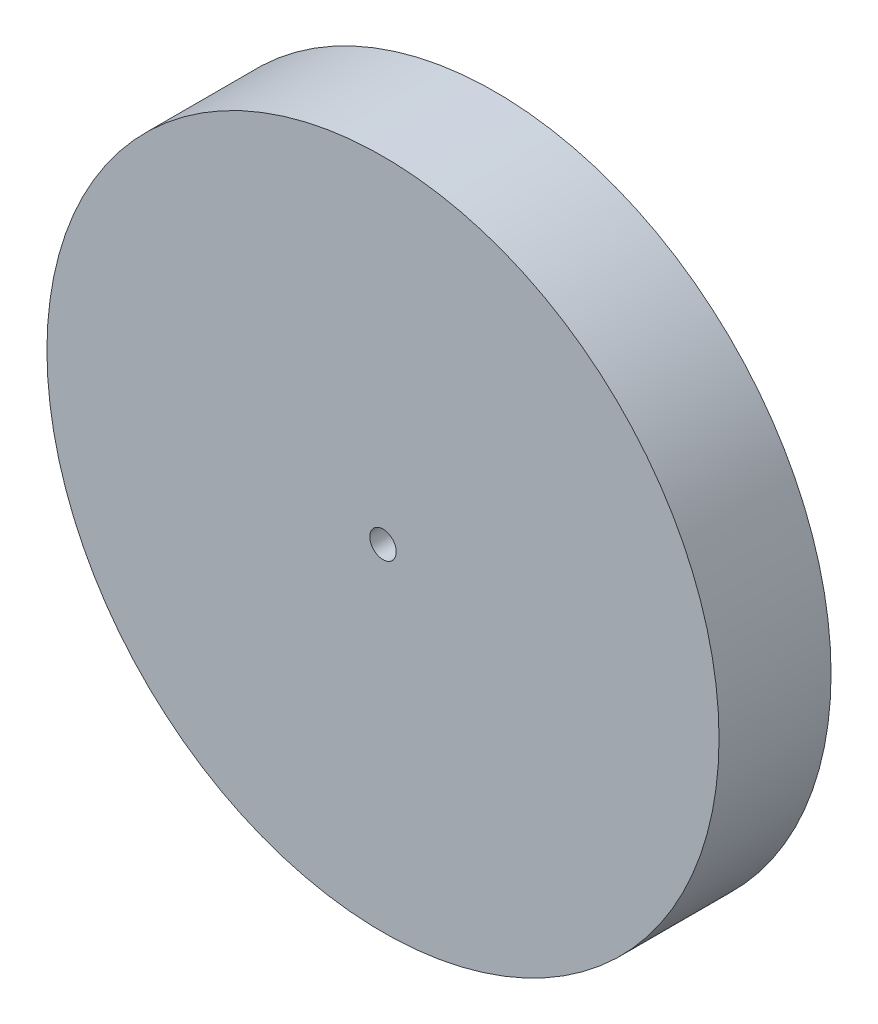
ISO-10303-21;
HEADER;
FILE_DESCRIPTION(('STEP AP214'),'2;1');
FILE_NAME('part.step','',(''),(''),'','','');
FILE_SCHEMA(('AUTOMOTIVE_DESIGN { 1 0 10303 214 1 1 1 1 }'));
ENDSEC;
DATA;
#1=APPLICATION_CONTEXT('core data for automotive mechanical design processes');
#2=APPLICATION_PROTOCOL_DEFINITION('international standard','automotive_design',2000,#1);
#3=PRODUCT_CONTEXT('',#1,'mechanical');
#4=PRODUCT('Part','Part','',(#3));
#5=PRODUCT_RELATED_PRODUCT_CATEGORY('part','',(#4));
#6=PRODUCT_DEFINITION_FORMATION('','',#4);
#7=PRODUCT_DEFINITION_CONTEXT('part definition',#1,'design');
#8=PRODUCT_DEFINITION('design','',#6,#7);
#9=PRODUCT_DEFINITION_SHAPE('','',#8);
#10=(LENGTH_UNIT() NAMED_UNIT(*) SI_UNIT(.MILLI.,.METRE.));
#11=(NAMED_UNIT(*) PLANE_ANGLE_UNIT() SI_UNIT($,.RADIAN.));
#12=(NAMED_UNIT(*) SI_UNIT($,.STERADIAN.) SOLID_ANGLE_UNIT());
#13=UNCERTAINTY_MEASURE_WITH_UNIT(LENGTH_MEASURE(1.E-05),#10,'distance_accuracy_value','');
#14=(GEOMETRIC_REPRESENTATION_CONTEXT(3) GLOBAL_UNCERTAINTY_ASSIGNED_CONTEXT((#13)) GLOBAL_UNIT_ASSIGNED_CONTEXT((#10,
#11,#12)) REPRESENTATION_CONTEXT('',''));
#15=CARTESIAN_POINT('',(0.,0.,0.));
#16=DIRECTION('',(0.,0.,1.));
#17=DIRECTION('',(1.,0.,0.));
#18=AXIS2_PLACEMENT_3D('',#15,#16,#17);
#19=CARTESIAN_POINT('',(0.,0.,25.4));
#20=DIRECTION('',(0.,0.,1.));
#21=DIRECTION('',(1.,0.,0.));
#22=AXIS2_PLACEMENT_3D('',#19,#20,#21);
#23=PLANE('',#22);
#24=CARTESIAN_POINT('',(0.,0.,25.4));
#25=DIRECTION('',(0.,0.,1.));
#26=DIRECTION('',(1.,0.,0.));
#27=AXIS2_PLACEMENT_3D('',#24,#25,#26);
#28=CIRCLE('',#27,76.2);
#29=CARTESIAN_POINT('',(76.2,0.,25.4));
#30=VERTEX_POINT('',#29);
#31=EDGE_CURVE('E10',#30,#30,#28,.T.);
#32=ORIENTED_EDGE('',*,*,#31,.T.);
#33=EDGE_LOOP('',(#32));
#34=FACE_BOUND('',#33,.T.);
#35=CARTESIAN_POINT('',(0.,0.,25.4));
#36=DIRECTION('',(0.,0.,1.));
#37=DIRECTION('',(1.,0.,0.));
#38=AXIS2_PLACEMENT_3D('',#35,#36,#37);
#39=CIRCLE('',#38,3.);
#40=CARTESIAN_POINT('',(3.,0.,25.4));
#41=VERTEX_POINT('',#40);
#42=EDGE_CURVE('E42',#41,#41,#39,.T.);
#43=ORIENTED_EDGE('',*,*,#42,.F.);
#44=EDGE_LOOP('',(#43));
#45=FACE_BOUND('',#44,.T.);
#46=ADVANCED_FACE('F31',(#34,#45),#23,.T.);
#47=CARTESIAN_POINT('',(0.,0.,0.));
#48=DIRECTION('',(0.,0.,1.));
#49=DIRECTION('',(1.,0.,0.));
#50=AXIS2_PLACEMENT_3D('',#47,#48,#49);
#51=PLANE('',#50);
#52=CARTESIAN_POINT('',(0.,0.,0.));
#53=DIRECTION('',(0.,0.,1.));
#54=DIRECTION('',(1.,0.,0.));
#55=AXIS2_PLACEMENT_3D('',#52,#53,#54);
#56=CIRCLE('',#55,76.2);
#57=CARTESIAN_POINT('',(76.2,0.,0.));
#58=VERTEX_POINT('',#57);
#59=EDGE_CURVE('E35',#58,#58,#56,.T.);
#60=ORIENTED_EDGE('',*,*,#59,.F.);
#61=EDGE_LOOP('',(#60));
#62=FACE_BOUND('',#61,.T.);
#63=CARTESIAN_POINT('',(0.,0.,0.));
#64=DIRECTION('',(0.,0.,1.));
#65=DIRECTION('',(1.,0.,0.));
#66=AXIS2_PLACEMENT_3D('',#63,#64,#65);
#67=CIRCLE('',#66,3.);
#68=CARTESIAN_POINT('',(3.,0.,0.));
#69=VERTEX_POINT('',#68);
#70=EDGE_CURVE('E44',#69,#69,#67,.T.);
#71=ORIENTED_EDGE('',*,*,#70,.T.);
#72=EDGE_LOOP('',(#71));
#73=FACE_BOUND('',#72,.T.);
#74=ADVANCED_FACE('F54',(#62,#73),#51,.F.);
#75=CARTESIAN_POINT('',(0.,0.,25.4));
#76=DIRECTION('',(0.,0.,-1.));
#77=DIRECTION('',(-1.,0.,0.));
#78=AXIS2_PLACEMENT_3D('',#75,#76,#77);
#79=CYLINDRICAL_SURFACE('',#78,76.2);
#80=ORIENTED_EDGE('',*,*,#31,.F.);
#81=EDGE_LOOP('',(#80));
#82=FACE_BOUND('',#81,.T.);
#83=ORIENTED_EDGE('',*,*,#59,.T.);
#84=EDGE_LOOP('',(#83));
#85=FACE_BOUND('',#84,.T.);
#86=ADVANCED_FACE('F33',(#82,#85),#79,.T.);
#87=CARTESIAN_POINT('',(0.,0.,25.4));
#88=DIRECTION('',(0.,0.,-1.));
#89=DIRECTION('',(-1.,0.,0.));
#90=AXIS2_PLACEMENT_3D('',#87,#88,#89);
#91=CYLINDRICAL_SURFACE('',#90,3.);
#92=ORIENTED_EDGE('',*,*,#42,.T.);
#93=EDGE_LOOP('',(#92));
#94=FACE_BOUND('',#93,.T.);
#95=ORIENTED_EDGE('',*,*,#70,.F.);
#96=EDGE_LOOP('',(#95));
#97=FACE_BOUND('',#96,.T.);
#98=ADVANCED_FACE('F50',(#94,#97),#91,.F.);
#99=CLOSED_SHELL('',(#46,#74,#86,#98));
#100=MANIFOLD_SOLID_BREP('B2',#99);
#101=ADVANCED_BREP_SHAPE_REPRESENTATION('',(#18,#100),#14);
#102=SHAPE_DEFINITION_REPRESENTATION(#9,#101);
ENDSEC;
END-ISO-10303-21;
